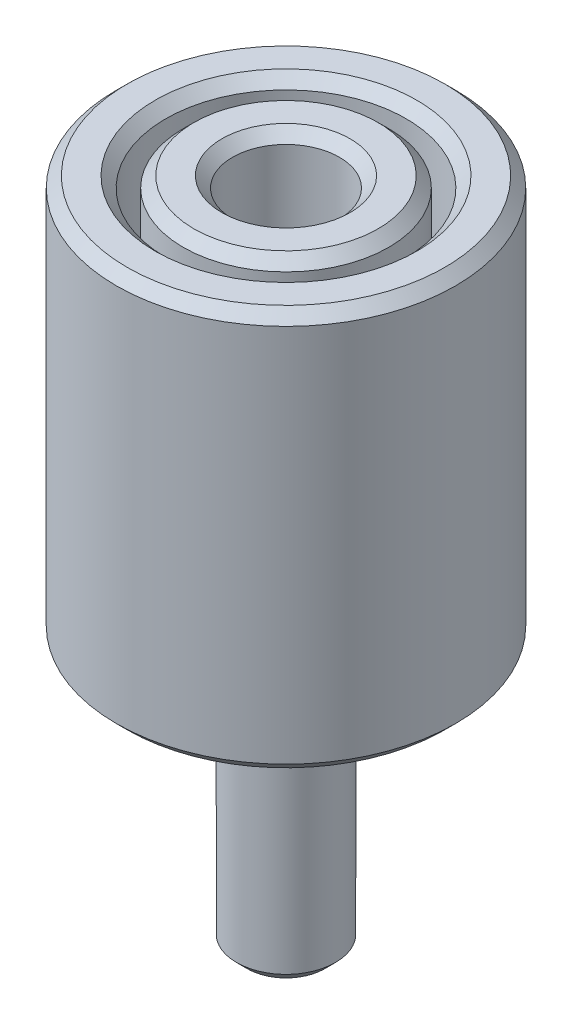
ISO-10303-21;
HEADER;
FILE_DESCRIPTION(('STEP AP214'),'2;1');
FILE_NAME('part.step','',(''),(''),'','','');
FILE_SCHEMA(('AUTOMOTIVE_DESIGN { 1 0 10303 214 1 1 1 1 }'));
ENDSEC;
DATA;
#1=APPLICATION_CONTEXT('core data for automotive mechanical design processes');
#2=APPLICATION_PROTOCOL_DEFINITION('international standard','automotive_design',2000,#1);
#3=PRODUCT_CONTEXT('',#1,'mechanical');
#4=PRODUCT('Part','Part','',(#3));
#5=PRODUCT_RELATED_PRODUCT_CATEGORY('part','',(#4));
#6=PRODUCT_DEFINITION_FORMATION('','',#4);
#7=PRODUCT_DEFINITION_CONTEXT('part definition',#1,'design');
#8=PRODUCT_DEFINITION('design','',#6,#7);
#9=PRODUCT_DEFINITION_SHAPE('','',#8);
#10=(LENGTH_UNIT() NAMED_UNIT(*) SI_UNIT(.MILLI.,.METRE.));
#11=(NAMED_UNIT(*) PLANE_ANGLE_UNIT() SI_UNIT($,.RADIAN.));
#12=(NAMED_UNIT(*) SI_UNIT($,.STERADIAN.) SOLID_ANGLE_UNIT());
#13=UNCERTAINTY_MEASURE_WITH_UNIT(LENGTH_MEASURE(1.E-05),#10,'distance_accuracy_value','');
#14=(GEOMETRIC_REPRESENTATION_CONTEXT(3) GLOBAL_UNCERTAINTY_ASSIGNED_CONTEXT((#13)) GLOBAL_UNIT_ASSIGNED_CONTEXT((#10,
#11,#12)) REPRESENTATION_CONTEXT('',''));
#15=CARTESIAN_POINT('',(0.,0.,0.));
#16=DIRECTION('',(0.,0.,1.));
#17=DIRECTION('',(1.,0.,0.));
#18=AXIS2_PLACEMENT_3D('',#15,#16,#17);
#19=CARTESIAN_POINT('',(-2.,11.4996007984032,0.));
#20=DIRECTION('',(0.,1.,0.));
#21=DIRECTION('',(0.,0.,1.));
#22=AXIS2_PLACEMENT_3D('',#19,#20,#21);
#23=PLANE('',#22);
#24=CARTESIAN_POINT('',(0.,11.4996007984032,0.));
#25=DIRECTION('',(0.,1.,0.));
#26=DIRECTION('',(0.,0.,1.));
#27=AXIS2_PLACEMENT_3D('',#24,#25,#26);
#28=CIRCLE('',#27,2.);
#29=CARTESIAN_POINT('',(0.,11.4996007984032,2.));
#30=VERTEX_POINT('',#29);
#31=EDGE_CURVE('E80',#30,#30,#28,.T.);
#32=ORIENTED_EDGE('',*,*,#31,.T.);
#33=EDGE_LOOP('',(#32));
#34=FACE_BOUND('',#33,.T.);
#35=ADVANCED_FACE('F35',(#34),#23,.T.);
#36=CARTESIAN_POINT('',(0.,11.4996007984032,0.));
#37=DIRECTION('',(0.,1.,0.));
#38=DIRECTION('',(0.,0.,1.));
#39=AXIS2_PLACEMENT_3D('',#36,#37,#38);
#40=CYLINDRICAL_SURFACE('',#39,2.);
#41=CARTESIAN_POINT('',(0.,24.6,0.));
#42=DIRECTION('',(0.,1.,0.));
#43=DIRECTION('',(0.,0.,1.));
#44=AXIS2_PLACEMENT_3D('',#41,#42,#43);
#45=CIRCLE('',#44,2.);
#46=CARTESIAN_POINT('',(0.,24.6,2.));
#47=VERTEX_POINT('',#46);
#48=EDGE_CURVE('E77',#47,#47,#45,.T.);
#49=ORIENTED_EDGE('',*,*,#48,.T.);
#50=EDGE_LOOP('',(#49));
#51=FACE_BOUND('',#50,.T.);
#52=ORIENTED_EDGE('',*,*,#31,.F.);
#53=EDGE_LOOP('',(#52));
#54=FACE_BOUND('',#53,.T.);
#55=ADVANCED_FACE('F116',(#51,#54),#40,.F.);
#56=CARTESIAN_POINT('',(-3.85,25.,0.));
#57=DIRECTION('',(0.,1.,0.));
#58=DIRECTION('',(0.,0.,1.));
#59=AXIS2_PLACEMENT_3D('',#56,#57,#58);
#60=PLANE('',#59);
#61=CARTESIAN_POINT('',(0.,25.,0.));
#62=DIRECTION('',(0.,1.,0.));
#63=DIRECTION('',(0.,0.,1.));
#64=AXIS2_PLACEMENT_3D('',#61,#62,#63);
#65=CIRCLE('',#64,2.39999999999999);
#66=CARTESIAN_POINT('',(0.,25.,2.39999999999999));
#67=VERTEX_POINT('',#66);
#68=EDGE_CURVE('E71',#67,#67,#65,.F.);
#69=ORIENTED_EDGE('',*,*,#68,.T.);
#70=EDGE_LOOP('',(#69));
#71=FACE_BOUND('',#70,.T.);
#72=CARTESIAN_POINT('',(0.,25.,0.));
#73=DIRECTION('',(0.,1.,0.));
#74=DIRECTION('',(0.,0.,1.));
#75=AXIS2_PLACEMENT_3D('',#72,#73,#74);
#76=CIRCLE('',#75,3.44999999999999);
#77=CARTESIAN_POINT('',(0.,25.,3.44999999999999));
#78=VERTEX_POINT('',#77);
#79=EDGE_CURVE('E74',#78,#78,#76,.T.);
#80=ORIENTED_EDGE('',*,*,#79,.T.);
#81=EDGE_LOOP('',(#80));
#82=FACE_BOUND('',#81,.T.);
#83=ADVANCED_FACE('F122',(#71,#82),#60,.T.);
#84=CARTESIAN_POINT('',(0.,11.4996007984032,0.));
#85=DIRECTION('',(0.,1.,0.));
#86=DIRECTION('',(0.,0.,1.));
#87=AXIS2_PLACEMENT_3D('',#84,#85,#86);
#88=CYLINDRICAL_SURFACE('',#87,3.85);
#89=CARTESIAN_POINT('',(0.,24.6,0.));
#90=DIRECTION('',(0.,1.,0.));
#91=DIRECTION('',(0.,0.,1.));
#92=AXIS2_PLACEMENT_3D('',#89,#90,#91);
#93=CIRCLE('',#92,3.85);
#94=CARTESIAN_POINT('',(0.,24.6,3.85));
#95=VERTEX_POINT('',#94);
#96=EDGE_CURVE('E68',#95,#95,#93,.F.);
#97=ORIENTED_EDGE('',*,*,#96,.T.);
#98=EDGE_LOOP('',(#97));
#99=FACE_BOUND('',#98,.T.);
#100=CARTESIAN_POINT('',(0.,11.4996007984032,0.));
#101=DIRECTION('',(0.,1.,0.));
#102=DIRECTION('',(0.,0.,1.));
#103=AXIS2_PLACEMENT_3D('',#100,#101,#102);
#104=CIRCLE('',#103,3.85);
#105=CARTESIAN_POINT('',(0.,11.4996007984032,3.85));
#106=VERTEX_POINT('',#105);
#107=EDGE_CURVE('E83',#106,#106,#104,.T.);
#108=ORIENTED_EDGE('',*,*,#107,.T.);
#109=EDGE_LOOP('',(#108));
#110=FACE_BOUND('',#109,.T.);
#111=ADVANCED_FACE('F192',(#99,#110),#88,.T.);
#112=CARTESIAN_POINT('',(-4.5,11.4996007984032,0.));
#113=DIRECTION('',(0.,1.,0.));
#114=DIRECTION('',(0.,0.,1.));
#115=AXIS2_PLACEMENT_3D('',#112,#113,#114);
#116=PLANE('',#115);
#117=CARTESIAN_POINT('',(0.,11.4996007984032,0.));
#118=DIRECTION('',(0.,1.,0.));
#119=DIRECTION('',(0.,0.,1.));
#120=AXIS2_PLACEMENT_3D('',#117,#118,#119);
#121=CIRCLE('',#120,4.5);
#122=CARTESIAN_POINT('',(0.,11.4996007984032,4.5));
#123=VERTEX_POINT('',#122);
#124=EDGE_CURVE('E86',#123,#123,#121,.T.);
#125=ORIENTED_EDGE('',*,*,#124,.T.);
#126=EDGE_LOOP('',(#125));
#127=FACE_BOUND('',#126,.T.);
#128=ORIENTED_EDGE('',*,*,#107,.F.);
#129=EDGE_LOOP('',(#128));
#130=FACE_BOUND('',#129,.T.);
#131=ADVANCED_FACE('F188',(#127,#130),#116,.T.);
#132=CARTESIAN_POINT('',(0.,11.4996007984032,0.));
#133=DIRECTION('',(0.,1.,0.));
#134=DIRECTION('',(0.,0.,1.));
#135=AXIS2_PLACEMENT_3D('',#132,#133,#134);
#136=CYLINDRICAL_SURFACE('',#135,4.5);
#137=CARTESIAN_POINT('',(0.,24.6,0.));
#138=DIRECTION('',(0.,1.,0.));
#139=DIRECTION('',(0.,0.,1.));
#140=AXIS2_PLACEMENT_3D('',#137,#138,#139);
#141=CIRCLE('',#140,4.5);
#142=CARTESIAN_POINT('',(0.,24.6,4.5));
#143=VERTEX_POINT('',#142);
#144=EDGE_CURVE('E65',#143,#143,#141,.T.);
#145=ORIENTED_EDGE('',*,*,#144,.T.);
#146=EDGE_LOOP('',(#145));
#147=FACE_BOUND('',#146,.T.);
#148=ORIENTED_EDGE('',*,*,#124,.F.);
#149=EDGE_LOOP('',(#148));
#150=FACE_BOUND('',#149,.T.);
#151=ADVANCED_FACE('F181',(#147,#150),#136,.F.);
#152=CARTESIAN_POINT('',(-6.35,25.,0.));
#153=DIRECTION('',(0.,1.,0.));
#154=DIRECTION('',(0.,0.,1.));
#155=AXIS2_PLACEMENT_3D('',#152,#153,#154);
#156=PLANE('',#155);
#157=CARTESIAN_POINT('',(0.,25.,0.));
#158=DIRECTION('',(0.,1.,0.));
#159=DIRECTION('',(0.,0.,1.));
#160=AXIS2_PLACEMENT_3D('',#157,#158,#159);
#161=CIRCLE('',#160,4.9);
#162=CARTESIAN_POINT('',(0.,25.,4.9));
#163=VERTEX_POINT('',#162);
#164=EDGE_CURVE('E59',#163,#163,#161,.F.);
#165=ORIENTED_EDGE('',*,*,#164,.T.);
#166=EDGE_LOOP('',(#165));
#167=FACE_BOUND('',#166,.T.);
#168=CARTESIAN_POINT('',(0.,25.,0.));
#169=DIRECTION('',(0.,1.,0.));
#170=DIRECTION('',(0.,0.,1.));
#171=AXIS2_PLACEMENT_3D('',#168,#169,#170);
#172=CIRCLE('',#171,5.95);
#173=CARTESIAN_POINT('',(0.,25.,5.95));
#174=VERTEX_POINT('',#173);
#175=EDGE_CURVE('E62',#174,#174,#172,.T.);
#176=ORIENTED_EDGE('',*,*,#175,.T.);
#177=EDGE_LOOP('',(#176));
#178=FACE_BOUND('',#177,.T.);
#179=ADVANCED_FACE('F173',(#167,#178),#156,.T.);
#180=CARTESIAN_POINT('',(0.,11.4996007984032,0.));
#181=DIRECTION('',(0.,1.,0.));
#182=DIRECTION('',(0.,0.,1.));
#183=AXIS2_PLACEMENT_3D('',#180,#181,#182);
#184=CYLINDRICAL_SURFACE('',#183,6.35);
#185=CARTESIAN_POINT('',(0.,24.6,0.));
#186=DIRECTION('',(0.,1.,0.));
#187=DIRECTION('',(0.,0.,1.));
#188=AXIS2_PLACEMENT_3D('',#185,#186,#187);
#189=CIRCLE('',#188,6.35);
#190=CARTESIAN_POINT('',(0.,24.6,6.35));
#191=VERTEX_POINT('',#190);
#192=EDGE_CURVE('E51',#191,#191,#189,.F.);
#193=ORIENTED_EDGE('',*,*,#192,.T.);
#194=EDGE_LOOP('',(#193));
#195=FACE_BOUND('',#194,.T.);
#196=CARTESIAN_POINT('',(0.,10.4,0.));
#197=DIRECTION('',(0.,-1.,0.));
#198=DIRECTION('',(0.,0.,-1.));
#199=AXIS2_PLACEMENT_3D('',#196,#197,#198);
#200=CIRCLE('',#199,6.35);
#201=CARTESIAN_POINT('',(0.,10.4,6.35));
#202=VERTEX_POINT('',#201);
#203=EDGE_CURVE('E56',#202,#202,#200,.F.);
#204=ORIENTED_EDGE('',*,*,#203,.T.);
#205=EDGE_LOOP('',(#204));
#206=FACE_BOUND('',#205,.T.);
#207=ADVANCED_FACE('F170',(#195,#206),#184,.T.);
#208=CARTESIAN_POINT('',(-6.35,10.,0.));
#209=DIRECTION('',(0.,-1.,0.));
#210=DIRECTION('',(0.,0.,-1.));
#211=AXIS2_PLACEMENT_3D('',#208,#209,#210);
#212=PLANE('',#211);
#213=CARTESIAN_POINT('',(0.,10.,0.));
#214=DIRECTION('',(0.,-1.,0.));
#215=DIRECTION('',(0.,0.,-1.));
#216=AXIS2_PLACEMENT_3D('',#213,#214,#215);
#217=CIRCLE('',#216,5.95);
#218=CARTESIAN_POINT('',(0.,10.,5.95));
#219=VERTEX_POINT('',#218);
#220=EDGE_CURVE('E10',#219,#219,#217,.T.);
#221=ORIENTED_EDGE('',*,*,#220,.T.);
#222=EDGE_LOOP('',(#221));
#223=FACE_BOUND('',#222,.T.);
#224=CARTESIAN_POINT('',(0.,10.,0.));
#225=DIRECTION('',(0.,1.,0.));
#226=DIRECTION('',(0.,0.,1.));
#227=AXIS2_PLACEMENT_3D('',#224,#225,#226);
#228=CIRCLE('',#227,2.5);
#229=CARTESIAN_POINT('',(0.,10.,2.5));
#230=VERTEX_POINT('',#229);
#231=EDGE_CURVE('E89',#230,#230,#228,.T.);
#232=ORIENTED_EDGE('',*,*,#231,.T.);
#233=EDGE_LOOP('',(#232));
#234=FACE_BOUND('',#233,.T.);
#235=ADVANCED_FACE('F172',(#223,#234),#212,.T.);
#236=CARTESIAN_POINT('',(0.,11.4996007984032,0.));
#237=DIRECTION('',(0.,1.,0.));
#238=DIRECTION('',(0.,0.,1.));
#239=AXIS2_PLACEMENT_3D('',#236,#237,#238);
#240=CYLINDRICAL_SURFACE('',#239,2.5);
#241=CARTESIAN_POINT('',(0.,9.,0.));
#242=DIRECTION('',(0.,1.,0.));
#243=DIRECTION('',(0.,0.,1.));
#244=AXIS2_PLACEMENT_3D('',#241,#242,#243);
#245=CIRCLE('',#244,2.5);
#246=CARTESIAN_POINT('',(0.,9.,2.5));
#247=VERTEX_POINT('',#246);
#248=EDGE_CURVE('E92',#247,#247,#245,.T.);
#249=ORIENTED_EDGE('',*,*,#248,.T.);
#250=EDGE_LOOP('',(#249));
#251=FACE_BOUND('',#250,.T.);
#252=ORIENTED_EDGE('',*,*,#231,.F.);
#253=EDGE_LOOP('',(#252));
#254=FACE_BOUND('',#253,.T.);
#255=ADVANCED_FACE('F113',(#251,#254),#240,.T.);
#256=CARTESIAN_POINT('',(-2.5,9.,0.));
#257=DIRECTION('',(0.,-1.,0.));
#258=DIRECTION('',(0.,0.,-1.));
#259=AXIS2_PLACEMENT_3D('',#256,#257,#258);
#260=PLANE('',#259);
#261=CARTESIAN_POINT('',(0.,9.,0.));
#262=DIRECTION('',(0.,1.,0.));
#263=DIRECTION('',(0.,0.,1.));
#264=AXIS2_PLACEMENT_3D('',#261,#262,#263);
#265=CIRCLE('',#264,1.85);
#266=CARTESIAN_POINT('',(0.,9.,1.85));
#267=VERTEX_POINT('',#266);
#268=EDGE_CURVE('E95',#267,#267,#265,.T.);
#269=ORIENTED_EDGE('',*,*,#268,.T.);
#270=EDGE_LOOP('',(#269));
#271=FACE_BOUND('',#270,.T.);
#272=ORIENTED_EDGE('',*,*,#248,.F.);
#273=EDGE_LOOP('',(#272));
#274=FACE_BOUND('',#273,.T.);
#275=ADVANCED_FACE('F99',(#271,#274),#260,.T.);
#276=CARTESIAN_POINT('',(0.,11.4996007984032,0.));
#277=DIRECTION('',(0.,1.,0.));
#278=DIRECTION('',(0.,0.,1.));
#279=AXIS2_PLACEMENT_3D('',#276,#277,#278);
#280=CYLINDRICAL_SURFACE('',#279,1.85);
#281=CARTESIAN_POINT('',(0.,0.400000000000005,0.));
#282=DIRECTION('',(0.,-1.,0.));
#283=DIRECTION('',(0.,0.,-1.));
#284=AXIS2_PLACEMENT_3D('',#281,#282,#283);
#285=CIRCLE('',#284,1.85);
#286=CARTESIAN_POINT('',(0.,0.400000000000005,-1.85));
#287=VERTEX_POINT('',#286);
#288=EDGE_CURVE('E47',#287,#287,#285,.F.);
#289=ORIENTED_EDGE('',*,*,#288,.T.);
#290=EDGE_LOOP('',(#289));
#291=FACE_BOUND('',#290,.T.);
#292=ORIENTED_EDGE('',*,*,#268,.F.);
#293=EDGE_LOOP('',(#292));
#294=FACE_BOUND('',#293,.T.);
#295=ADVANCED_FACE('F102',(#291,#294),#280,.T.);
#296=CARTESIAN_POINT('',(-1.85,0.,0.));
#297=DIRECTION('',(0.,-1.,0.));
#298=DIRECTION('',(0.,0.,-1.));
#299=AXIS2_PLACEMENT_3D('',#296,#297,#298);
#300=PLANE('',#299);
#301=CARTESIAN_POINT('',(0.,0.,0.));
#302=DIRECTION('',(0.,-1.,0.));
#303=DIRECTION('',(0.,0.,-1.));
#304=AXIS2_PLACEMENT_3D('',#301,#302,#303);
#305=CIRCLE('',#304,1.45);
#306=CARTESIAN_POINT('',(0.,0.,-1.45));
#307=VERTEX_POINT('',#306);
#308=EDGE_CURVE('E43',#307,#307,#305,.T.);
#309=ORIENTED_EDGE('',*,*,#308,.T.);
#310=EDGE_LOOP('',(#309));
#311=FACE_BOUND('',#310,.T.);
#312=ADVANCED_FACE('F104',(#311),#300,.T.);
#313=CARTESIAN_POINT('',(0.,24.6,0.));
#314=DIRECTION('',(0.,1.,0.));
#315=DIRECTION('',(0.,0.,1.));
#316=AXIS2_PLACEMENT_3D('',#313,#314,#315);
#317=CONICAL_SURFACE('',#316,2.,0.785398163397445);
#318=ORIENTED_EDGE('',*,*,#68,.F.);
#319=EDGE_LOOP('',(#318));
#320=FACE_BOUND('',#319,.T.);
#321=ORIENTED_EDGE('',*,*,#48,.F.);
#322=EDGE_LOOP('',(#321));
#323=FACE_BOUND('',#322,.T.);
#324=ADVANCED_FACE('F111',(#320,#323),#317,.F.);
#325=CARTESIAN_POINT('',(0.,25.,0.));
#326=DIRECTION('',(0.,-1.,0.));
#327=DIRECTION('',(0.,0.,-1.));
#328=AXIS2_PLACEMENT_3D('',#325,#326,#327);
#329=CONICAL_SURFACE('',#328,3.44999999999999,0.785398163397449);
#330=ORIENTED_EDGE('',*,*,#96,.F.);
#331=EDGE_LOOP('',(#330));
#332=FACE_BOUND('',#331,.T.);
#333=ORIENTED_EDGE('',*,*,#79,.F.);
#334=EDGE_LOOP('',(#333));
#335=FACE_BOUND('',#334,.T.);
#336=ADVANCED_FACE('F133',(#332,#335),#329,.T.);
#337=CARTESIAN_POINT('',(0.,24.6,0.));
#338=DIRECTION('',(0.,1.,0.));
#339=DIRECTION('',(0.,0.,1.));
#340=AXIS2_PLACEMENT_3D('',#337,#338,#339);
#341=CONICAL_SURFACE('',#340,4.5,0.785398163397445);
#342=ORIENTED_EDGE('',*,*,#164,.F.);
#343=EDGE_LOOP('',(#342));
#344=FACE_BOUND('',#343,.T.);
#345=ORIENTED_EDGE('',*,*,#144,.F.);
#346=EDGE_LOOP('',(#345));
#347=FACE_BOUND('',#346,.T.);
#348=ADVANCED_FACE('F140',(#344,#347),#341,.F.);
#349=CARTESIAN_POINT('',(0.,25.,0.));
#350=DIRECTION('',(0.,-1.,0.));
#351=DIRECTION('',(0.,0.,-1.));
#352=AXIS2_PLACEMENT_3D('',#349,#350,#351);
#353=CONICAL_SURFACE('',#352,5.95,0.785398163397444);
#354=ORIENTED_EDGE('',*,*,#192,.F.);
#355=EDGE_LOOP('',(#354));
#356=FACE_BOUND('',#355,.T.);
#357=ORIENTED_EDGE('',*,*,#175,.F.);
#358=EDGE_LOOP('',(#357));
#359=FACE_BOUND('',#358,.T.);
#360=ADVANCED_FACE('F147',(#356,#359),#353,.T.);
#361=CARTESIAN_POINT('',(0.,0.400000000000005,0.));
#362=DIRECTION('',(0.,1.,0.));
#363=DIRECTION('',(0.,0.,1.));
#364=AXIS2_PLACEMENT_3D('',#361,#362,#363);
#365=CONICAL_SURFACE('',#364,1.85,0.785398163397447);
#366=ORIENTED_EDGE('',*,*,#308,.F.);
#367=EDGE_LOOP('',(#366));
#368=FACE_BOUND('',#367,.T.);
#369=ORIENTED_EDGE('',*,*,#288,.F.);
#370=EDGE_LOOP('',(#369));
#371=FACE_BOUND('',#370,.T.);
#372=ADVANCED_FACE('F153',(#368,#371),#365,.T.);
#373=CARTESIAN_POINT('',(0.,10.4,0.));
#374=DIRECTION('',(0.,1.,0.));
#375=DIRECTION('',(0.,0.,1.));
#376=AXIS2_PLACEMENT_3D('',#373,#374,#375);
#377=CONICAL_SURFACE('',#376,6.35,0.785398163397451);
#378=CARTESIAN_POINT('',(0.,10.,5.95));
#379=CARTESIAN_POINT('',(0.,10.0041666666667,5.95416666666666));
#380=CARTESIAN_POINT('',(0.,10.0083333333333,5.95833333333333));
#381=CARTESIAN_POINT('',(0.,10.0166666666667,5.96666666666666));
#382=CARTESIAN_POINT('',(0.,10.0208333333333,5.97083333333333));
#383=CARTESIAN_POINT('',(0.,10.0291666666667,5.97916666666667));
#384=CARTESIAN_POINT('',(0.,10.0333333333333,5.98333333333333));
#385=CARTESIAN_POINT('',(0.,10.0416666666667,5.99166666666667));
#386=CARTESIAN_POINT('',(0.,10.0458333333333,5.99583333333333));
#387=CARTESIAN_POINT('',(0.,10.0541666666667,6.00416666666666));
#388=CARTESIAN_POINT('',(0.,10.0583333333333,6.00833333333333));
#389=CARTESIAN_POINT('',(0.,10.0666666666667,6.01666666666666));
#390=CARTESIAN_POINT('',(0.,10.0708333333333,6.02083333333333));
#391=CARTESIAN_POINT('',(0.,10.0791666666667,6.02916666666667));
#392=CARTESIAN_POINT('',(0.,10.0833333333333,6.03333333333333));
#393=CARTESIAN_POINT('',(0.,10.0916666666667,6.04166666666667));
#394=CARTESIAN_POINT('',(0.,10.0958333333333,6.04583333333333));
#395=CARTESIAN_POINT('',(0.,10.1041666666667,6.05416666666667));
#396=CARTESIAN_POINT('',(0.,10.1083333333333,6.05833333333333));
#397=CARTESIAN_POINT('',(0.,10.1166666666667,6.06666666666666));
#398=CARTESIAN_POINT('',(0.,10.1208333333333,6.07083333333333));
#399=CARTESIAN_POINT('',(0.,10.1291666666667,6.07916666666666));
#400=CARTESIAN_POINT('',(0.,10.1333333333333,6.08333333333333));
#401=CARTESIAN_POINT('',(0.,10.1416666666667,6.09166666666667));
#402=CARTESIAN_POINT('',(0.,10.1458333333333,6.09583333333333));
#403=CARTESIAN_POINT('',(0.,10.1541666666667,6.10416666666667));
#404=CARTESIAN_POINT('',(0.,10.1583333333333,6.10833333333333));
#405=CARTESIAN_POINT('',(0.,10.1666666666667,6.11666666666666));
#406=CARTESIAN_POINT('',(0.,10.1708333333333,6.12083333333333));
#407=CARTESIAN_POINT('',(0.,10.1791666666667,6.12916666666667));
#408=CARTESIAN_POINT('',(0.,10.1833333333333,6.13333333333333));
#409=CARTESIAN_POINT('',(0.,10.1916666666667,6.14166666666666));
#410=CARTESIAN_POINT('',(0.,10.1958333333333,6.14583333333333));
#411=CARTESIAN_POINT('',(0.,10.2041666666667,6.15416666666667));
#412=CARTESIAN_POINT('',(0.,10.2083333333333,6.15833333333333));
#413=CARTESIAN_POINT('',(0.,10.2166666666667,6.16666666666667));
#414=CARTESIAN_POINT('',(0.,10.2208333333333,6.17083333333333));
#415=CARTESIAN_POINT('',(0.,10.2291666666667,6.17916666666667));
#416=CARTESIAN_POINT('',(0.,10.2333333333333,6.18333333333333));
#417=CARTESIAN_POINT('',(0.,10.2416666666667,6.19166666666667));
#418=CARTESIAN_POINT('',(0.,10.2458333333333,6.19583333333333));
#419=CARTESIAN_POINT('',(0.,10.2541666666667,6.20416666666667));
#420=CARTESIAN_POINT('',(0.,10.2583333333333,6.20833333333333));
#421=CARTESIAN_POINT('',(0.,10.2666666666667,6.21666666666667));
#422=CARTESIAN_POINT('',(0.,10.2708333333333,6.22083333333333));
#423=CARTESIAN_POINT('',(0.,10.2791666666667,6.22916666666667));
#424=CARTESIAN_POINT('',(0.,10.2833333333333,6.23333333333333));
#425=CARTESIAN_POINT('',(0.,10.2916666666667,6.24166666666667));
#426=CARTESIAN_POINT('',(0.,10.2958333333333,6.24583333333333));
#427=CARTESIAN_POINT('',(0.,10.3041666666667,6.25416666666667));
#428=CARTESIAN_POINT('',(0.,10.3083333333333,6.25833333333333));
#429=CARTESIAN_POINT('',(0.,10.3166666666667,6.26666666666667));
#430=CARTESIAN_POINT('',(0.,10.3208333333333,6.27083333333333));
#431=CARTESIAN_POINT('',(0.,10.3291666666667,6.27916666666667));
#432=CARTESIAN_POINT('',(0.,10.3333333333333,6.28333333333333));
#433=CARTESIAN_POINT('',(0.,10.3416666666667,6.29166666666667));
#434=CARTESIAN_POINT('',(0.,10.3458333333333,6.29583333333333));
#435=CARTESIAN_POINT('',(0.,10.3541666666667,6.30416666666667));
#436=CARTESIAN_POINT('',(0.,10.3583333333333,6.30833333333333));
#437=CARTESIAN_POINT('',(0.,10.3666666666667,6.31666666666667));
#438=CARTESIAN_POINT('',(0.,10.3708333333333,6.32083333333333));
#439=CARTESIAN_POINT('',(0.,10.3791666666667,6.32916666666667));
#440=CARTESIAN_POINT('',(0.,10.3833333333333,6.33333333333333));
#441=CARTESIAN_POINT('',(0.,10.3916666666667,6.34166666666667));
#442=CARTESIAN_POINT('',(0.,10.3958333333333,6.34583333333333));
#443=CARTESIAN_POINT('',(0.,10.4,6.35));
#444=B_SPLINE_CURVE_WITH_KNOTS('',3,(#378,#379,#380,#381,#382,#383,#384,#385,#386,#387,#388,
#389,#390,#391,#392,#393,#394,#395,#396,#397,#398,#399,#400,#401,#402,#403,#404,#405,#406,#407,
#408,#409,#410,#411,#412,#413,#414,#415,#416,#417,#418,#419,#420,#421,#422,#423,#424,#425,#426,
#427,#428,#429,#430,#431,#432,#433,#434,#435,#436,#437,#438,#439,#440,#441,#442,#443),
.UNSPECIFIED.,.F.,.F.,(4,2,2,2,2,2,2,2,2,2,2,2,2,2,2,2,2,2,2,2,2,2,2,2,2,2,2,2,2,2,2,2,4),(0.,
0.0176776695296642,0.0353553390593278,0.053033008588992,0.0707106781186562,0.0883883476483185,
0.106066017177983,0.123743686707647,0.14142135623731,0.159099025766975,0.176776695296637,
0.194454364826301,0.212132034355965,0.229809703885629,0.247487373415292,0.265165042944956,
0.28284271247462,0.300520382004284,0.318198051533948,0.335875721063611,0.353553390593275,
0.371231060122939,0.388908729652603,0.406586399182265,0.42426406871193,0.441941738241593,
0.459619407771257,0.477297077300922,0.494974746830584,0.512652416360248,0.530330085889912,
0.548007755419576,0.565685424949239),.UNSPECIFIED.);
#445=EDGE_CURVE('BSEAM38',#219,#202,#444,.T.);
#446=ORIENTED_EDGE('',*,*,#220,.F.);
#447=ORIENTED_EDGE('',*,*,#203,.F.);
#448=ORIENTED_EDGE('',*,*,#445,.T.);
#449=ORIENTED_EDGE('',*,*,#445,.F.);
#450=EDGE_LOOP('',(#446,#448,#447,#449));
#451=FACE_BOUND('',#450,.T.);
#452=ADVANCED_FACE('F38',(#451),#377,.T.);
#453=CLOSED_SHELL('',(#35,#55,#83,#111,#131,#151,#179,#207,#235,#255,#275,#295,#312,#324,#336,
#348,#360,#372,#452));
#454=MANIFOLD_SOLID_BREP('B2',#453);
#455=ADVANCED_BREP_SHAPE_REPRESENTATION('',(#18,#454),#14);
#456=SHAPE_DEFINITION_REPRESENTATION(#9,#455);
ENDSEC;
END-ISO-10303-21;
